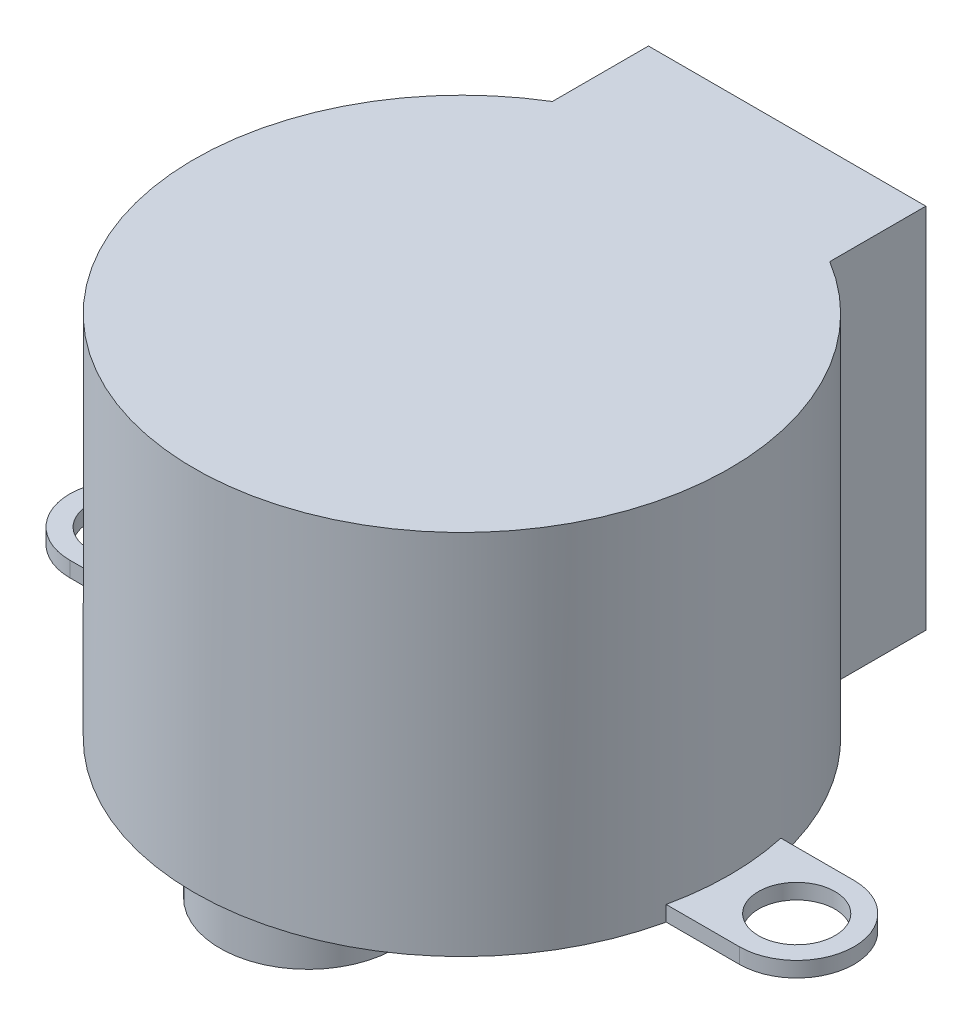
ISO-10303-21;
HEADER;
FILE_DESCRIPTION(('STEP AP214'),'2;1');
FILE_NAME('part.step','',(''),(''),'','','');
FILE_SCHEMA(('AUTOMOTIVE_DESIGN { 1 0 10303 214 1 1 1 1 }'));
ENDSEC;
DATA;
#1=APPLICATION_CONTEXT('core data for automotive mechanical design processes');
#2=APPLICATION_PROTOCOL_DEFINITION('international standard','automotive_design',2000,#1);
#3=PRODUCT_CONTEXT('',#1,'mechanical');
#4=PRODUCT('Part','Part','',(#3));
#5=PRODUCT_RELATED_PRODUCT_CATEGORY('part','',(#4));
#6=PRODUCT_DEFINITION_FORMATION('','',#4);
#7=PRODUCT_DEFINITION_CONTEXT('part definition',#1,'design');
#8=PRODUCT_DEFINITION('design','',#6,#7);
#9=PRODUCT_DEFINITION_SHAPE('','',#8);
#10=(LENGTH_UNIT() NAMED_UNIT(*) SI_UNIT(.MILLI.,.METRE.));
#11=(NAMED_UNIT(*) PLANE_ANGLE_UNIT() SI_UNIT($,.RADIAN.));
#12=(NAMED_UNIT(*) SI_UNIT($,.STERADIAN.) SOLID_ANGLE_UNIT());
#13=UNCERTAINTY_MEASURE_WITH_UNIT(LENGTH_MEASURE(1.E-05),#10,'distance_accuracy_value','');
#14=(GEOMETRIC_REPRESENTATION_CONTEXT(3) GLOBAL_UNCERTAINTY_ASSIGNED_CONTEXT((#13)) GLOBAL_UNIT_ASSIGNED_CONTEXT((#10,
#11,#12)) REPRESENTATION_CONTEXT('',''));
#15=CARTESIAN_POINT('',(0.,0.,0.));
#16=DIRECTION('',(0.,0.,1.));
#17=DIRECTION('',(1.,0.,0.));
#18=AXIS2_PLACEMENT_3D('',#15,#16,#17);
#19=CARTESIAN_POINT('',(-1.28230759344206E-13,6.8,8.05));
#20=DIRECTION('',(0.,-1.,0.));
#21=DIRECTION('',(0.,0.,-1.));
#22=AXIS2_PLACEMENT_3D('',#19,#20,#21);
#23=PLANE('',#22);
#24=CARTESIAN_POINT('',(-1.28100941995372E-13,6.8,8.05));
#25=DIRECTION('',(0.,1.,0.));
#26=DIRECTION('',(0.,0.,1.));
#27=AXIS2_PLACEMENT_3D('',#24,#25,#26);
#28=CIRCLE('',#27,2.5);
#29=CARTESIAN_POINT('',(-1.28100941995372E-13,6.8,10.55));
#30=VERTEX_POINT('',#29);
#31=EDGE_CURVE('E19',#30,#30,#28,.F.);
#32=ORIENTED_EDGE('',*,*,#31,.T.);
#33=EDGE_LOOP('',(#32));
#34=FACE_BOUND('',#33,.T.);
#35=ADVANCED_FACE('F16',(#34),#23,.T.);
#36=CARTESIAN_POINT('',(-1.28100941995372E-13,-3.2,8.05));
#37=DIRECTION('',(0.,1.,0.));
#38=DIRECTION('',(0.,0.,1.));
#39=AXIS2_PLACEMENT_3D('',#36,#37,#38);
#40=CYLINDRICAL_SURFACE('',#39,2.5);
#41=ORIENTED_EDGE('',*,*,#31,.F.);
#42=EDGE_LOOP('',(#41));
#43=FACE_BOUND('',#42,.T.);
#44=CARTESIAN_POINT('',(-1.28100941995372E-13,-3.2,8.05));
#45=DIRECTION('',(0.,1.,0.));
#46=DIRECTION('',(0.,0.,1.));
#47=AXIS2_PLACEMENT_3D('',#44,#45,#46);
#48=CIRCLE('',#47,2.5);
#49=CARTESIAN_POINT('',(-1.28100941995372E-13,-3.2,10.55));
#50=VERTEX_POINT('',#49);
#51=EDGE_CURVE('E164',#50,#50,#48,.T.);
#52=ORIENTED_EDGE('',*,*,#51,.F.);
#53=EDGE_LOOP('',(#52));
#54=FACE_BOUND('',#53,.T.);
#55=ADVANCED_FACE('F213',(#43,#54),#40,.F.);
#56=CARTESIAN_POINT('',(-1.28230759344206E-13,-3.2,8.05));
#57=DIRECTION('',(0.,-1.,0.));
#58=DIRECTION('',(0.,0.,-1.));
#59=AXIS2_PLACEMENT_3D('',#56,#57,#58);
#60=PLANE('',#59);
#61=ORIENTED_EDGE('',*,*,#51,.T.);
#62=EDGE_LOOP('',(#61));
#63=FACE_BOUND('',#62,.T.);
#64=CARTESIAN_POINT('',(-1.28100941995372E-13,-3.2,8.05));
#65=DIRECTION('',(0.,-1.,0.));
#66=DIRECTION('',(0.,0.,-1.));
#67=AXIS2_PLACEMENT_3D('',#64,#65,#66);
#68=CIRCLE('',#67,4.6);
#69=CARTESIAN_POINT('',(-1.28100941995372E-13,-3.2,3.45));
#70=VERTEX_POINT('',#69);
#71=EDGE_CURVE('E128',#70,#70,#68,.F.);
#72=ORIENTED_EDGE('',*,*,#71,.F.);
#73=EDGE_LOOP('',(#72));
#74=FACE_BOUND('',#73,.T.);
#75=ADVANCED_FACE('F216',(#63,#74),#60,.T.);
#76=CARTESIAN_POINT('',(13.6747943311773,0.,3.));
#77=DIRECTION('',(0.,0.,1.));
#78=DIRECTION('',(1.,0.,0.));
#79=AXIS2_PLACEMENT_3D('',#76,#77,#78);
#80=PLANE('',#79);
#81=DIRECTION('',(1.,0.,0.));
#82=VECTOR('',#81,1.);
#83=CARTESIAN_POINT('',(17.0873971655887,0.8,3.));
#84=LINE('',#83,#82);
#85=CARTESIAN_POINT('',(17.5,0.8,3.));
#86=VERTEX_POINT('',#85);
#87=CARTESIAN_POINT('',(13.6747943311773,0.8,3.));
#88=VERTEX_POINT('',#87);
#89=EDGE_CURVE('E202',#86,#88,#84,.F.);
#90=ORIENTED_EDGE('',*,*,#89,.T.);
#91=DIRECTION('',(0.,1.,0.));
#92=VECTOR('',#91,1.);
#93=CARTESIAN_POINT('',(13.6747943311773,0.,3.));
#94=LINE('',#93,#92);
#95=CARTESIAN_POINT('',(13.6747943311773,0.,3.));
#96=VERTEX_POINT('',#95);
#97=EDGE_CURVE('E163',#88,#96,#94,.F.);
#98=ORIENTED_EDGE('',*,*,#97,.T.);
#99=DIRECTION('',(1.,0.,0.));
#100=VECTOR('',#99,1.);
#101=CARTESIAN_POINT('',(0.,0.,3.));
#102=LINE('',#101,#100);
#103=CARTESIAN_POINT('',(17.5,0.,3.));
#104=VERTEX_POINT('',#103);
#105=EDGE_CURVE('E194',#96,#104,#102,.T.);
#106=ORIENTED_EDGE('',*,*,#105,.T.);
#107=DIRECTION('',(0.,1.,0.));
#108=VECTOR('',#107,1.);
#109=CARTESIAN_POINT('',(17.5,0.,3.));
#110=LINE('',#109,#108);
#111=EDGE_CURVE('E160',#86,#104,#110,.F.);
#112=ORIENTED_EDGE('',*,*,#111,.F.);
#113=EDGE_LOOP('',(#90,#98,#106,#112));
#114=FACE_BOUND('',#113,.T.);
#115=ADVANCED_FACE('F222',(#114),#80,.T.);
#116=CARTESIAN_POINT('',(17.5,0.,0.));
#117=DIRECTION('',(0.,1.,0.));
#118=DIRECTION('',(0.,0.,1.));
#119=AXIS2_PLACEMENT_3D('',#116,#117,#118);
#120=CYLINDRICAL_SURFACE('',#119,3.);
#121=CARTESIAN_POINT('',(17.5,0.8,0.));
#122=DIRECTION('',(0.,1.,0.));
#123=DIRECTION('',(0.,0.,1.));
#124=AXIS2_PLACEMENT_3D('',#121,#122,#123);
#125=CIRCLE('',#124,3.);
#126=CARTESIAN_POINT('',(17.5,0.8,-3.));
#127=VERTEX_POINT('',#126);
#128=EDGE_CURVE('E199',#127,#86,#125,.F.);
#129=ORIENTED_EDGE('',*,*,#128,.T.);
#130=ORIENTED_EDGE('',*,*,#111,.T.);
#131=CARTESIAN_POINT('',(17.5,0.,0.));
#132=DIRECTION('',(0.,1.,0.));
#133=DIRECTION('',(0.,0.,1.));
#134=AXIS2_PLACEMENT_3D('',#131,#132,#133);
#135=CIRCLE('',#134,3.);
#136=CARTESIAN_POINT('',(17.5,0.,-3.));
#137=VERTEX_POINT('',#136);
#138=EDGE_CURVE('E192',#104,#137,#135,.T.);
#139=ORIENTED_EDGE('',*,*,#138,.T.);
#140=DIRECTION('',(0.,1.,0.));
#141=VECTOR('',#140,1.);
#142=CARTESIAN_POINT('',(17.5,0.,-3.));
#143=LINE('',#142,#141);
#144=EDGE_CURVE('E155',#127,#137,#143,.F.);
#145=ORIENTED_EDGE('',*,*,#144,.F.);
#146=EDGE_LOOP('',(#129,#130,#139,#145));
#147=FACE_BOUND('',#146,.T.);
#148=ADVANCED_FACE('F281',(#147),#120,.T.);
#149=CARTESIAN_POINT('',(17.5,0.,-3.));
#150=DIRECTION('',(0.,0.,-1.));
#151=DIRECTION('',(-1.,0.,0.));
#152=AXIS2_PLACEMENT_3D('',#149,#150,#151);
#153=PLANE('',#152);
#154=DIRECTION('',(1.,0.,0.));
#155=VECTOR('',#154,1.);
#156=CARTESIAN_POINT('',(17.0873971655887,0.8,-3.));
#157=LINE('',#156,#155);
#158=CARTESIAN_POINT('',(13.6747943311773,0.8,-3.));
#159=VERTEX_POINT('',#158);
#160=EDGE_CURVE('E198',#159,#127,#157,.T.);
#161=ORIENTED_EDGE('',*,*,#160,.T.);
#162=ORIENTED_EDGE('',*,*,#144,.T.);
#163=DIRECTION('',(1.,0.,0.));
#164=VECTOR('',#163,1.);
#165=CARTESIAN_POINT('',(0.,0.,-3.));
#166=LINE('',#165,#164);
#167=CARTESIAN_POINT('',(13.6747943311773,0.,-3.));
#168=VERTEX_POINT('',#167);
#169=EDGE_CURVE('E149',#137,#168,#166,.F.);
#170=ORIENTED_EDGE('',*,*,#169,.T.);
#171=DIRECTION('',(0.,1.,0.));
#172=VECTOR('',#171,1.);
#173=CARTESIAN_POINT('',(13.6747943311773,0.,-3.));
#174=LINE('',#173,#172);
#175=EDGE_CURVE('E158',#168,#159,#174,.T.);
#176=ORIENTED_EDGE('',*,*,#175,.T.);
#177=EDGE_LOOP('',(#161,#162,#170,#176));
#178=FACE_BOUND('',#177,.T.);
#179=ADVANCED_FACE('F278',(#178),#153,.T.);
#180=CARTESIAN_POINT('',(-13.6747943311773,0.,-3.));
#181=DIRECTION('',(0.,0.,-1.));
#182=DIRECTION('',(-1.,0.,0.));
#183=AXIS2_PLACEMENT_3D('',#180,#181,#182);
#184=PLANE('',#183);
#185=DIRECTION('',(1.,0.,0.));
#186=VECTOR('',#185,1.);
#187=CARTESIAN_POINT('',(-17.0873971655887,0.8,-3.));
#188=LINE('',#187,#186);
#189=CARTESIAN_POINT('',(-17.5,0.8,-3.));
#190=VERTEX_POINT('',#189);
#191=CARTESIAN_POINT('',(-13.6747943311773,0.8,-3.));
#192=VERTEX_POINT('',#191);
#193=EDGE_CURVE('E105',#190,#192,#188,.T.);
#194=ORIENTED_EDGE('',*,*,#193,.T.);
#195=DIRECTION('',(0.,1.,0.));
#196=VECTOR('',#195,1.);
#197=CARTESIAN_POINT('',(-13.6747943311773,0.,-3.));
#198=LINE('',#197,#196);
#199=CARTESIAN_POINT('',(-13.6747943311773,0.,-3.));
#200=VERTEX_POINT('',#199);
#201=EDGE_CURVE('E111',#192,#200,#198,.F.);
#202=ORIENTED_EDGE('',*,*,#201,.T.);
#203=DIRECTION('',(1.,0.,0.));
#204=VECTOR('',#203,1.);
#205=CARTESIAN_POINT('',(0.,0.,-3.));
#206=LINE('',#205,#204);
#207=CARTESIAN_POINT('',(-17.5,0.,-3.));
#208=VERTEX_POINT('',#207);
#209=EDGE_CURVE('E108',#200,#208,#206,.F.);
#210=ORIENTED_EDGE('',*,*,#209,.T.);
#211=DIRECTION('',(0.,1.,0.));
#212=VECTOR('',#211,1.);
#213=CARTESIAN_POINT('',(-17.5,0.,-3.));
#214=LINE('',#213,#212);
#215=EDGE_CURVE('E102',#190,#208,#214,.F.);
#216=ORIENTED_EDGE('',*,*,#215,.F.);
#217=EDGE_LOOP('',(#194,#202,#210,#216));
#218=FACE_BOUND('',#217,.T.);
#219=ADVANCED_FACE('F103',(#218),#184,.T.);
#220=CARTESIAN_POINT('',(-17.5,0.,0.));
#221=DIRECTION('',(0.,1.,0.));
#222=DIRECTION('',(0.,0.,1.));
#223=AXIS2_PLACEMENT_3D('',#220,#221,#222);
#224=CYLINDRICAL_SURFACE('',#223,3.);
#225=CARTESIAN_POINT('',(-17.5,0.8,0.));
#226=DIRECTION('',(0.,1.,0.));
#227=DIRECTION('',(0.,0.,1.));
#228=AXIS2_PLACEMENT_3D('',#225,#226,#227);
#229=CIRCLE('',#228,3.);
#230=CARTESIAN_POINT('',(-17.5,0.8,3.));
#231=VERTEX_POINT('',#230);
#232=EDGE_CURVE('E114',#231,#190,#229,.F.);
#233=ORIENTED_EDGE('',*,*,#232,.T.);
#234=ORIENTED_EDGE('',*,*,#215,.T.);
#235=CARTESIAN_POINT('',(-17.5,0.,0.));
#236=DIRECTION('',(0.,1.,0.));
#237=DIRECTION('',(0.,0.,1.));
#238=AXIS2_PLACEMENT_3D('',#235,#236,#237);
#239=CIRCLE('',#238,3.);
#240=CARTESIAN_POINT('',(-17.5,0.,3.));
#241=VERTEX_POINT('',#240);
#242=EDGE_CURVE('E190',#208,#241,#239,.T.);
#243=ORIENTED_EDGE('',*,*,#242,.T.);
#244=DIRECTION('',(0.,1.,0.));
#245=VECTOR('',#244,1.);
#246=CARTESIAN_POINT('',(-17.5,0.,3.));
#247=LINE('',#246,#245);
#248=EDGE_CURVE('E96',#231,#241,#247,.F.);
#249=ORIENTED_EDGE('',*,*,#248,.F.);
#250=EDGE_LOOP('',(#233,#234,#243,#249));
#251=FACE_BOUND('',#250,.T.);
#252=ADVANCED_FACE('F115',(#251),#224,.T.);
#253=CARTESIAN_POINT('',(-17.5,0.,3.));
#254=DIRECTION('',(0.,0.,1.));
#255=DIRECTION('',(1.,0.,0.));
#256=AXIS2_PLACEMENT_3D('',#253,#254,#255);
#257=PLANE('',#256);
#258=DIRECTION('',(1.,0.,0.));
#259=VECTOR('',#258,1.);
#260=CARTESIAN_POINT('',(-17.0873971655887,0.8,3.));
#261=LINE('',#260,#259);
#262=CARTESIAN_POINT('',(-13.6747943311773,0.8,3.));
#263=VERTEX_POINT('',#262);
#264=EDGE_CURVE('E119',#263,#231,#261,.F.);
#265=ORIENTED_EDGE('',*,*,#264,.T.);
#266=ORIENTED_EDGE('',*,*,#248,.T.);
#267=DIRECTION('',(1.,0.,0.));
#268=VECTOR('',#267,1.);
#269=CARTESIAN_POINT('',(0.,0.,3.));
#270=LINE('',#269,#268);
#271=CARTESIAN_POINT('',(-13.6747943311773,0.,3.));
#272=VERTEX_POINT('',#271);
#273=EDGE_CURVE('E189',#241,#272,#270,.T.);
#274=ORIENTED_EDGE('',*,*,#273,.T.);
#275=DIRECTION('',(0.,1.,0.));
#276=VECTOR('',#275,1.);
#277=CARTESIAN_POINT('',(-13.6747943311773,0.,3.));
#278=LINE('',#277,#276);
#279=EDGE_CURVE('E110',#272,#263,#278,.T.);
#280=ORIENTED_EDGE('',*,*,#279,.T.);
#281=EDGE_LOOP('',(#265,#266,#274,#280));
#282=FACE_BOUND('',#281,.T.);
#283=ADVANCED_FACE('F269',(#282),#257,.T.);
#284=CARTESIAN_POINT('',(-1.28100941995372E-13,0.,8.05));
#285=DIRECTION('',(0.,-1.,0.));
#286=DIRECTION('',(0.,0.,-1.));
#287=AXIS2_PLACEMENT_3D('',#284,#285,#286);
#288=CYLINDRICAL_SURFACE('',#287,4.6);
#289=CARTESIAN_POINT('',(-1.28100941995372E-13,0.,8.05));
#290=DIRECTION('',(0.,-1.,0.));
#291=DIRECTION('',(0.,0.,-1.));
#292=AXIS2_PLACEMENT_3D('',#289,#290,#291);
#293=CIRCLE('',#292,4.6);
#294=CARTESIAN_POINT('',(-1.28100941995372E-13,0.,3.45));
#295=VERTEX_POINT('',#294);
#296=EDGE_CURVE('E186',#295,#295,#293,.T.);
#297=ORIENTED_EDGE('',*,*,#296,.T.);
#298=EDGE_LOOP('',(#297));
#299=FACE_BOUND('',#298,.T.);
#300=ORIENTED_EDGE('',*,*,#71,.T.);
#301=EDGE_LOOP('',(#300));
#302=FACE_BOUND('',#301,.T.);
#303=ADVANCED_FACE('F265',(#299,#302),#288,.T.);
#304=CARTESIAN_POINT('',(17.5,0.,0.));
#305=DIRECTION('',(0.,1.,0.));
#306=DIRECTION('',(0.,0.,1.));
#307=AXIS2_PLACEMENT_3D('',#304,#305,#306);
#308=CYLINDRICAL_SURFACE('',#307,2.);
#309=CARTESIAN_POINT('',(17.5,0.,0.));
#310=DIRECTION('',(0.,1.,0.));
#311=DIRECTION('',(0.,0.,1.));
#312=AXIS2_PLACEMENT_3D('',#309,#310,#311);
#313=CIRCLE('',#312,2.);
#314=CARTESIAN_POINT('',(17.5,0.,2.));
#315=VERTEX_POINT('',#314);
#316=EDGE_CURVE('E183',#315,#315,#313,.F.);
#317=ORIENTED_EDGE('',*,*,#316,.T.);
#318=EDGE_LOOP('',(#317));
#319=FACE_BOUND('',#318,.T.);
#320=CARTESIAN_POINT('',(17.5,0.8,0.));
#321=DIRECTION('',(0.,1.,0.));
#322=DIRECTION('',(0.,0.,1.));
#323=AXIS2_PLACEMENT_3D('',#320,#321,#322);
#324=CIRCLE('',#323,2.);
#325=CARTESIAN_POINT('',(17.5,0.8,2.));
#326=VERTEX_POINT('',#325);
#327=EDGE_CURVE('E195',#326,#326,#324,.T.);
#328=ORIENTED_EDGE('',*,*,#327,.T.);
#329=EDGE_LOOP('',(#328));
#330=FACE_BOUND('',#329,.T.);
#331=ADVANCED_FACE('F261',(#319,#330),#308,.F.);
#332=CARTESIAN_POINT('',(-17.5,0.,0.));
#333=DIRECTION('',(0.,1.,0.));
#334=DIRECTION('',(0.,0.,1.));
#335=AXIS2_PLACEMENT_3D('',#332,#333,#334);
#336=CYLINDRICAL_SURFACE('',#335,2.);
#337=CARTESIAN_POINT('',(-17.5,0.,0.));
#338=DIRECTION('',(0.,1.,0.));
#339=DIRECTION('',(0.,0.,1.));
#340=AXIS2_PLACEMENT_3D('',#337,#338,#339);
#341=CIRCLE('',#340,2.);
#342=CARTESIAN_POINT('',(-17.5,0.,2.));
#343=VERTEX_POINT('',#342);
#344=EDGE_CURVE('E180',#343,#343,#341,.F.);
#345=ORIENTED_EDGE('',*,*,#344,.T.);
#346=EDGE_LOOP('',(#345));
#347=FACE_BOUND('',#346,.T.);
#348=CARTESIAN_POINT('',(-17.5,0.8,0.));
#349=DIRECTION('',(0.,1.,0.));
#350=DIRECTION('',(0.,0.,1.));
#351=AXIS2_PLACEMENT_3D('',#348,#349,#350);
#352=CIRCLE('',#351,2.);
#353=CARTESIAN_POINT('',(-17.5,0.8,2.));
#354=VERTEX_POINT('',#353);
#355=EDGE_CURVE('E118',#354,#354,#352,.T.);
#356=ORIENTED_EDGE('',*,*,#355,.T.);
#357=EDGE_LOOP('',(#356));
#358=FACE_BOUND('',#357,.T.);
#359=ADVANCED_FACE('F257',(#347,#358),#336,.F.);
#360=CARTESIAN_POINT('',(7.25000000000001,0.,-17.));
#361=DIRECTION('',(0.,0.,-1.));
#362=DIRECTION('',(-1.,0.,0.));
#363=AXIS2_PLACEMENT_3D('',#360,#361,#362);
#364=PLANE('',#363);
#365=DIRECTION('',(1.,0.,0.));
#366=VECTOR('',#365,1.);
#367=CARTESIAN_POINT('',(0.,19.2,-17.));
#368=LINE('',#367,#366);
#369=CARTESIAN_POINT('',(7.25,19.2,-17.));
#370=VERTEX_POINT('',#369);
#371=CARTESIAN_POINT('',(-7.25000000000271,19.2,-17.));
#372=VERTEX_POINT('',#371);
#373=EDGE_CURVE('E134',#370,#372,#368,.F.);
#374=ORIENTED_EDGE('',*,*,#373,.F.);
#375=DIRECTION('',(0.,1.,0.));
#376=VECTOR('',#375,1.);
#377=CARTESIAN_POINT('',(7.25,0.,-17.));
#378=LINE('',#377,#376);
#379=CARTESIAN_POINT('',(7.25,0.,-17.));
#380=VERTEX_POINT('',#379);
#381=EDGE_CURVE('E140',#380,#370,#378,.T.);
#382=ORIENTED_EDGE('',*,*,#381,.F.);
#383=DIRECTION('',(1.,0.,0.));
#384=VECTOR('',#383,1.);
#385=CARTESIAN_POINT('',(0.,0.,-17.));
#386=LINE('',#385,#384);
#387=CARTESIAN_POINT('',(-7.25000000000271,0.,-17.));
#388=VERTEX_POINT('',#387);
#389=EDGE_CURVE('E145',#380,#388,#386,.F.);
#390=ORIENTED_EDGE('',*,*,#389,.T.);
#391=DIRECTION('',(0.,1.,0.));
#392=VECTOR('',#391,1.);
#393=CARTESIAN_POINT('',(-7.25000000000271,0.,-17.));
#394=LINE('',#393,#392);
#395=EDGE_CURVE('E124',#372,#388,#394,.F.);
#396=ORIENTED_EDGE('',*,*,#395,.F.);
#397=EDGE_LOOP('',(#374,#382,#390,#396));
#398=FACE_BOUND('',#397,.T.);
#399=ADVANCED_FACE('F253',(#398),#364,.T.);
#400=CARTESIAN_POINT('',(-7.25000000000271,0.,-17.));
#401=DIRECTION('',(-1.,0.,0.));
#402=DIRECTION('',(0.,0.,1.));
#403=AXIS2_PLACEMENT_3D('',#400,#401,#402);
#404=PLANE('',#403);
#405=DIRECTION('',(0.,0.,1.));
#406=VECTOR('',#405,1.);
#407=CARTESIAN_POINT('',(-7.25000000000271,19.2,0.));
#408=LINE('',#407,#406);
#409=CARTESIAN_POINT('',(-7.25000000000234,19.2,-11.9765395670021));
#410=VERTEX_POINT('',#409);
#411=EDGE_CURVE('E137',#372,#410,#408,.T.);
#412=ORIENTED_EDGE('',*,*,#411,.F.);
#413=ORIENTED_EDGE('',*,*,#395,.T.);
#414=DIRECTION('',(0.,0.,1.));
#415=VECTOR('',#414,1.);
#416=CARTESIAN_POINT('',(-7.25000000000271,0.,0.));
#417=LINE('',#416,#415);
#418=CARTESIAN_POINT('',(-7.25000000000234,0.,-11.9765395670021));
#419=VERTEX_POINT('',#418);
#420=EDGE_CURVE('E148',#388,#419,#417,.T.);
#421=ORIENTED_EDGE('',*,*,#420,.T.);
#422=DIRECTION('',(0.,1.,0.));
#423=VECTOR('',#422,1.);
#424=CARTESIAN_POINT('',(-7.25000000000197,0.,-11.9765395670023));
#425=LINE('',#424,#423);
#426=EDGE_CURVE('E179',#410,#419,#425,.F.);
#427=ORIENTED_EDGE('',*,*,#426,.F.);
#428=EDGE_LOOP('',(#412,#413,#421,#427));
#429=FACE_BOUND('',#428,.T.);
#430=ADVANCED_FACE('F249',(#429),#404,.T.);
#431=CARTESIAN_POINT('',(-17.0873971655887,0.8,0.));
#432=DIRECTION('',(0.,-1.,0.));
#433=DIRECTION('',(0.,0.,-1.));
#434=AXIS2_PLACEMENT_3D('',#431,#432,#433);
#435=PLANE('',#434);
#436=ORIENTED_EDGE('',*,*,#355,.F.);
#437=EDGE_LOOP('',(#436));
#438=FACE_BOUND('',#437,.T.);
#439=ORIENTED_EDGE('',*,*,#264,.F.);
#440=CARTESIAN_POINT('',(0.,0.8,0.));
#441=DIRECTION('',(0.,1.,0.));
#442=DIRECTION('',(0.,0.,1.));
#443=AXIS2_PLACEMENT_3D('',#440,#441,#442);
#444=CIRCLE('',#443,14.);
#445=EDGE_CURVE('E123',#192,#263,#444,.T.);
#446=ORIENTED_EDGE('',*,*,#445,.F.);
#447=ORIENTED_EDGE('',*,*,#193,.F.);
#448=ORIENTED_EDGE('',*,*,#232,.F.);
#449=EDGE_LOOP('',(#439,#446,#447,#448));
#450=FACE_BOUND('',#449,.T.);
#451=ADVANCED_FACE('F121',(#438,#450),#435,.F.);
#452=CARTESIAN_POINT('',(17.0873971655887,0.8,0.));
#453=DIRECTION('',(0.,-1.,0.));
#454=DIRECTION('',(0.,0.,-1.));
#455=AXIS2_PLACEMENT_3D('',#452,#453,#454);
#456=PLANE('',#455);
#457=ORIENTED_EDGE('',*,*,#327,.F.);
#458=EDGE_LOOP('',(#457));
#459=FACE_BOUND('',#458,.T.);
#460=CARTESIAN_POINT('',(0.,0.8,0.));
#461=DIRECTION('',(0.,1.,0.));
#462=DIRECTION('',(0.,0.,1.));
#463=AXIS2_PLACEMENT_3D('',#460,#461,#462);
#464=CIRCLE('',#463,14.);
#465=EDGE_CURVE('E169',#88,#159,#464,.T.);
#466=ORIENTED_EDGE('',*,*,#465,.F.);
#467=ORIENTED_EDGE('',*,*,#89,.F.);
#468=ORIENTED_EDGE('',*,*,#128,.F.);
#469=ORIENTED_EDGE('',*,*,#160,.F.);
#470=EDGE_LOOP('',(#466,#467,#468,#469));
#471=FACE_BOUND('',#470,.T.);
#472=ADVANCED_FACE('F242',(#459,#471),#456,.F.);
#473=CARTESIAN_POINT('',(0.,0.,0.));
#474=DIRECTION('',(0.,1.,0.));
#475=DIRECTION('',(0.,0.,1.));
#476=AXIS2_PLACEMENT_3D('',#473,#474,#475);
#477=PLANE('',#476);
#478=ORIENTED_EDGE('',*,*,#344,.F.);
#479=EDGE_LOOP('',(#478));
#480=FACE_BOUND('',#479,.T.);
#481=ORIENTED_EDGE('',*,*,#316,.F.);
#482=EDGE_LOOP('',(#481));
#483=FACE_BOUND('',#482,.T.);
#484=ORIENTED_EDGE('',*,*,#296,.F.);
#485=EDGE_LOOP('',(#484));
#486=FACE_BOUND('',#485,.T.);
#487=ORIENTED_EDGE('',*,*,#273,.F.);
#488=ORIENTED_EDGE('',*,*,#242,.F.);
#489=ORIENTED_EDGE('',*,*,#209,.F.);
#490=CARTESIAN_POINT('',(0.,0.,0.));
#491=DIRECTION('',(0.,1.,0.));
#492=DIRECTION('',(0.,0.,1.));
#493=AXIS2_PLACEMENT_3D('',#490,#491,#492);
#494=CIRCLE('',#493,14.);
#495=EDGE_CURVE('E176',#419,#200,#494,.T.);
#496=ORIENTED_EDGE('',*,*,#495,.F.);
#497=ORIENTED_EDGE('',*,*,#420,.F.);
#498=ORIENTED_EDGE('',*,*,#389,.F.);
#499=DIRECTION('',(0.,0.,-1.));
#500=VECTOR('',#499,1.);
#501=CARTESIAN_POINT('',(7.25,0.,-11.9765395670035));
#502=LINE('',#501,#500);
#503=CARTESIAN_POINT('',(7.25,0.,-11.9765395670035));
#504=VERTEX_POINT('',#503);
#505=EDGE_CURVE('E142',#504,#380,#502,.T.);
#506=ORIENTED_EDGE('',*,*,#505,.F.);
#507=CARTESIAN_POINT('',(0.,0.,0.));
#508=DIRECTION('',(0.,1.,0.));
#509=DIRECTION('',(0.,0.,1.));
#510=AXIS2_PLACEMENT_3D('',#507,#508,#509);
#511=CIRCLE('',#510,14.);
#512=EDGE_CURVE('E166',#168,#504,#511,.T.);
#513=ORIENTED_EDGE('',*,*,#512,.F.);
#514=ORIENTED_EDGE('',*,*,#169,.F.);
#515=ORIENTED_EDGE('',*,*,#138,.F.);
#516=ORIENTED_EDGE('',*,*,#105,.F.);
#517=CARTESIAN_POINT('',(0.,0.,0.));
#518=DIRECTION('',(0.,1.,0.));
#519=DIRECTION('',(0.,0.,1.));
#520=AXIS2_PLACEMENT_3D('',#517,#518,#519);
#521=CIRCLE('',#520,14.);
#522=EDGE_CURVE('E172',#272,#96,#521,.T.);
#523=ORIENTED_EDGE('',*,*,#522,.F.);
#524=EDGE_LOOP('',(#487,#488,#489,#496,#497,#498,#506,#513,#514,#515,#516,#523));
#525=FACE_BOUND('',#524,.T.);
#526=ADVANCED_FACE('F239',(#480,#483,#486,#525),#477,.F.);
#527=CARTESIAN_POINT('',(7.25,0.,-11.9765395670035));
#528=DIRECTION('',(1.,0.,0.));
#529=DIRECTION('',(0.,0.,-1.));
#530=AXIS2_PLACEMENT_3D('',#527,#528,#529);
#531=PLANE('',#530);
#532=DIRECTION('',(0.,0.,1.));
#533=VECTOR('',#532,1.);
#534=CARTESIAN_POINT('',(7.25,19.2,0.));
#535=LINE('',#534,#533);
#536=CARTESIAN_POINT('',(7.25,19.2,-11.9765395670035));
#537=VERTEX_POINT('',#536);
#538=EDGE_CURVE('E34',#537,#370,#535,.F.);
#539=ORIENTED_EDGE('',*,*,#538,.F.);
#540=DIRECTION('',(0.,1.,0.));
#541=VECTOR('',#540,1.);
#542=CARTESIAN_POINT('',(7.25,0.,-11.9765395670035));
#543=LINE('',#542,#541);
#544=EDGE_CURVE('E25',#504,#537,#543,.T.);
#545=ORIENTED_EDGE('',*,*,#544,.F.);
#546=ORIENTED_EDGE('',*,*,#505,.T.);
#547=ORIENTED_EDGE('',*,*,#381,.T.);
#548=EDGE_LOOP('',(#539,#545,#546,#547));
#549=FACE_BOUND('',#548,.T.);
#550=ADVANCED_FACE('F232',(#549),#531,.T.);
#551=CARTESIAN_POINT('',(0.,19.2,0.));
#552=DIRECTION('',(0.,1.,0.));
#553=DIRECTION('',(0.,0.,1.));
#554=AXIS2_PLACEMENT_3D('',#551,#552,#553);
#555=PLANE('',#554);
#556=ORIENTED_EDGE('',*,*,#373,.T.);
#557=ORIENTED_EDGE('',*,*,#411,.T.);
#558=CARTESIAN_POINT('',(0.,19.2,0.));
#559=DIRECTION('',(0.,1.,0.));
#560=DIRECTION('',(0.,0.,1.));
#561=AXIS2_PLACEMENT_3D('',#558,#559,#560);
#562=CIRCLE('',#561,14.);
#563=EDGE_CURVE('E11',#537,#410,#562,.F.);
#564=ORIENTED_EDGE('',*,*,#563,.F.);
#565=ORIENTED_EDGE('',*,*,#538,.T.);
#566=EDGE_LOOP('',(#556,#557,#564,#565));
#567=FACE_BOUND('',#566,.T.);
#568=ADVANCED_FACE('F226',(#567),#555,.T.);
#569=CARTESIAN_POINT('',(0.,0.,0.));
#570=DIRECTION('',(0.,1.,0.));
#571=DIRECTION('',(0.,0.,1.));
#572=AXIS2_PLACEMENT_3D('',#569,#570,#571);
#573=CYLINDRICAL_SURFACE('',#572,14.);
#574=ORIENTED_EDGE('',*,*,#544,.T.);
#575=ORIENTED_EDGE('',*,*,#563,.T.);
#576=ORIENTED_EDGE('',*,*,#426,.T.);
#577=ORIENTED_EDGE('',*,*,#495,.T.);
#578=ORIENTED_EDGE('',*,*,#201,.F.);
#579=ORIENTED_EDGE('',*,*,#445,.T.);
#580=ORIENTED_EDGE('',*,*,#279,.F.);
#581=ORIENTED_EDGE('',*,*,#522,.T.);
#582=ORIENTED_EDGE('',*,*,#97,.F.);
#583=ORIENTED_EDGE('',*,*,#465,.T.);
#584=ORIENTED_EDGE('',*,*,#175,.F.);
#585=ORIENTED_EDGE('',*,*,#512,.T.);
#586=EDGE_LOOP('',(#574,#575,#576,#577,#578,#579,#580,#581,#582,#583,#584,#585));
#587=FACE_BOUND('',#586,.T.);
#588=ADVANCED_FACE('F224',(#587),#573,.T.);
#589=CLOSED_SHELL('',(#35,#55,#75,#115,#148,#179,#219,#252,#283,#303,#331,#359,#399,#430,#451,
#472,#526,#550,#568,#588));
#590=MANIFOLD_SOLID_BREP('B1',#589);
#591=ADVANCED_BREP_SHAPE_REPRESENTATION('',(#18,#590),#14);
#592=SHAPE_DEFINITION_REPRESENTATION(#9,#591);
ENDSEC;
END-ISO-10303-21;
